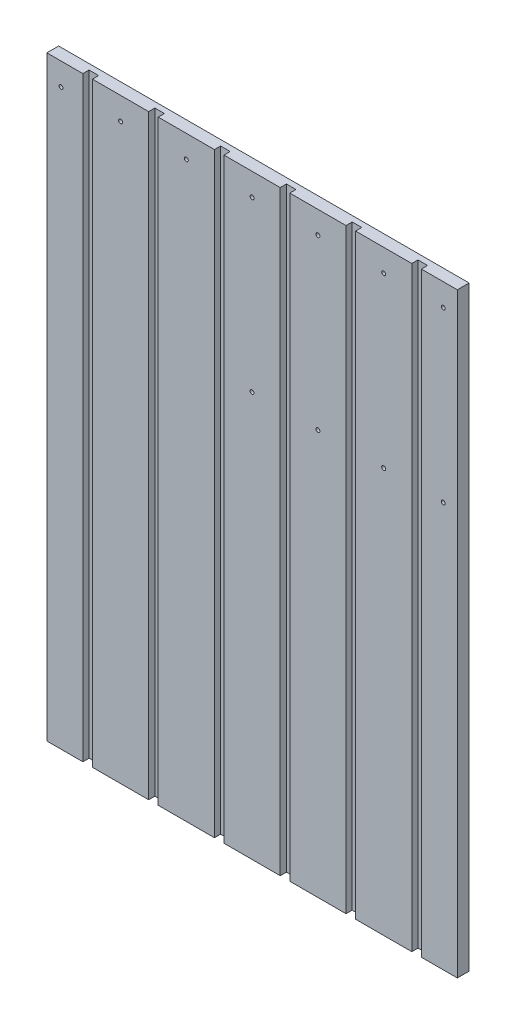
ISO-10303-21;
HEADER;
FILE_DESCRIPTION(('STEP AP214'),'2;1');
FILE_NAME('part.step','',(''),(''),'','','');
FILE_SCHEMA(('AUTOMOTIVE_DESIGN { 1 0 10303 214 1 1 1 1 }'));
ENDSEC;
DATA;
#1=APPLICATION_CONTEXT('core data for automotive mechanical design processes');
#2=APPLICATION_PROTOCOL_DEFINITION('international standard','automotive_design',2000,#1);
#3=PRODUCT_CONTEXT('',#1,'mechanical');
#4=PRODUCT('Part','Part','',(#3));
#5=PRODUCT_RELATED_PRODUCT_CATEGORY('part','',(#4));
#6=PRODUCT_DEFINITION_FORMATION('','',#4);
#7=PRODUCT_DEFINITION_CONTEXT('part definition',#1,'design');
#8=PRODUCT_DEFINITION('design','',#6,#7);
#9=PRODUCT_DEFINITION_SHAPE('','',#8);
#10=(LENGTH_UNIT() NAMED_UNIT(*) SI_UNIT(.MILLI.,.METRE.));
#11=(NAMED_UNIT(*) PLANE_ANGLE_UNIT() SI_UNIT($,.RADIAN.));
#12=(NAMED_UNIT(*) SI_UNIT($,.STERADIAN.) SOLID_ANGLE_UNIT());
#13=UNCERTAINTY_MEASURE_WITH_UNIT(LENGTH_MEASURE(1.E-05),#10,'distance_accuracy_value','');
#14=(GEOMETRIC_REPRESENTATION_CONTEXT(3) GLOBAL_UNCERTAINTY_ASSIGNED_CONTEXT((#13)) GLOBAL_UNIT_ASSIGNED_CONTEXT((#10,
#11,#12)) REPRESENTATION_CONTEXT('',''));
#15=CARTESIAN_POINT('',(0.,0.,0.));
#16=DIRECTION('',(0.,0.,1.));
#17=DIRECTION('',(1.,0.,0.));
#18=AXIS2_PLACEMENT_3D('',#15,#16,#17);
#19=CARTESIAN_POINT('',(0.,0.,21.));
#20=DIRECTION('',(0.,0.,-1.));
#21=DIRECTION('',(-1.,0.,0.));
#22=AXIS2_PLACEMENT_3D('',#19,#20,#21);
#23=PLANE('',#22);
#24=CARTESIAN_POINT('',(117.,190.,21.));
#25=DIRECTION('',(0.,0.,1.));
#26=DIRECTION('',(1.,0.,0.));
#27=AXIS2_PLACEMENT_3D('',#24,#25,#26);
#28=CIRCLE('',#27,3.50000000000001);
#29=CARTESIAN_POINT('',(120.5,190.,21.));
#30=VERTEX_POINT('',#29);
#31=EDGE_CURVE('E598',#30,#30,#28,.T.);
#32=ORIENTED_EDGE('',*,*,#31,.F.);
#33=EDGE_LOOP('',(#32));
#34=FACE_BOUND('',#33,.T.);
#35=CARTESIAN_POINT('',(117.,490.,21.));
#36=DIRECTION('',(0.,0.,1.));
#37=DIRECTION('',(1.,0.,0.));
#38=AXIS2_PLACEMENT_3D('',#35,#36,#37);
#39=CIRCLE('',#38,3.50000000000001);
#40=CARTESIAN_POINT('',(120.5,490.,21.));
#41=VERTEX_POINT('',#40);
#42=EDGE_CURVE('E605',#41,#41,#39,.T.);
#43=ORIENTED_EDGE('',*,*,#42,.F.);
#44=EDGE_LOOP('',(#43));
#45=FACE_BOUND('',#44,.T.);
#46=DIRECTION('',(1.,0.,0.));
#47=VECTOR('',#46,1.);
#48=CARTESIAN_POINT('',(365.,-530.,21.));
#49=LINE('',#48,#47);
#50=CARTESIAN_POINT('',(67.0000000000002,-530.,21.));
#51=VERTEX_POINT('',#50);
#52=CARTESIAN_POINT('',(167.,-530.,21.));
#53=VERTEX_POINT('',#52);
#54=EDGE_CURVE('E541',#51,#53,#49,.T.);
#55=ORIENTED_EDGE('',*,*,#54,.T.);
#56=DIRECTION('',(0.,-1.,0.));
#57=VECTOR('',#56,1.);
#58=CARTESIAN_POINT('',(167.,530.,21.));
#59=LINE('',#58,#57);
#60=CARTESIAN_POINT('',(167.,530.,21.));
#61=VERTEX_POINT('',#60);
#62=EDGE_CURVE('E275',#61,#53,#59,.T.);
#63=ORIENTED_EDGE('',*,*,#62,.F.);
#64=DIRECTION('',(-1.,0.,0.));
#65=VECTOR('',#64,1.);
#66=CARTESIAN_POINT('',(365.,530.,21.));
#67=LINE('',#66,#65);
#68=CARTESIAN_POINT('',(67.,530.,21.));
#69=VERTEX_POINT('',#68);
#70=EDGE_CURVE('E515',#61,#69,#67,.T.);
#71=ORIENTED_EDGE('',*,*,#70,.T.);
#72=DIRECTION('',(0.,1.,0.));
#73=VECTOR('',#72,1.);
#74=CARTESIAN_POINT('',(67.,530.,21.));
#75=LINE('',#74,#73);
#76=EDGE_CURVE('E367',#51,#69,#75,.T.);
#77=ORIENTED_EDGE('',*,*,#76,.F.);
#78=EDGE_LOOP('',(#55,#63,#71,#77));
#79=FACE_BOUND('',#78,.T.);
#80=ADVANCED_FACE('F33',(#34,#45,#79),#23,.F.);
#81=CARTESIAN_POINT('',(234.,190.,21.));
#82=DIRECTION('',(0.,0.,1.));
#83=DIRECTION('',(1.,0.,0.));
#84=AXIS2_PLACEMENT_3D('',#81,#82,#83);
#85=CIRCLE('',#84,3.49999999999999);
#86=CARTESIAN_POINT('',(237.5,190.,21.));
#87=VERTEX_POINT('',#86);
#88=EDGE_CURVE('E616',#87,#87,#85,.T.);
#89=ORIENTED_EDGE('',*,*,#88,.F.);
#90=EDGE_LOOP('',(#89));
#91=FACE_BOUND('',#90,.T.);
#92=CARTESIAN_POINT('',(234.,490.,21.));
#93=DIRECTION('',(0.,0.,1.));
#94=DIRECTION('',(1.,0.,0.));
#95=AXIS2_PLACEMENT_3D('',#92,#93,#94);
#96=CIRCLE('',#95,3.49999999999999);
#97=CARTESIAN_POINT('',(237.5,490.,21.));
#98=VERTEX_POINT('',#97);
#99=EDGE_CURVE('E608',#98,#98,#96,.T.);
#100=ORIENTED_EDGE('',*,*,#99,.F.);
#101=EDGE_LOOP('',(#100));
#102=FACE_BOUND('',#101,.T.);
#103=CARTESIAN_POINT('',(284.,530.,21.));
#104=VERTEX_POINT('',#103);
#105=CARTESIAN_POINT('',(184.,530.,21.));
#106=VERTEX_POINT('',#105);
#107=EDGE_CURVE('E405',#104,#106,#67,.T.);
#108=ORIENTED_EDGE('',*,*,#107,.T.);
#109=DIRECTION('',(0.,1.,0.));
#110=VECTOR('',#109,1.);
#111=CARTESIAN_POINT('',(184.,530.,21.));
#112=LINE('',#111,#110);
#113=CARTESIAN_POINT('',(184.,-530.,21.));
#114=VERTEX_POINT('',#113);
#115=EDGE_CURVE('E265',#114,#106,#112,.T.);
#116=ORIENTED_EDGE('',*,*,#115,.F.);
#117=CARTESIAN_POINT('',(284.,-530.,21.));
#118=VERTEX_POINT('',#117);
#119=EDGE_CURVE('E539',#114,#118,#49,.T.);
#120=ORIENTED_EDGE('',*,*,#119,.T.);
#121=DIRECTION('',(0.,-1.,0.));
#122=VECTOR('',#121,1.);
#123=CARTESIAN_POINT('',(284.,530.,21.));
#124=LINE('',#123,#122);
#125=EDGE_CURVE('E303',#104,#118,#124,.T.);
#126=ORIENTED_EDGE('',*,*,#125,.F.);
#127=EDGE_LOOP('',(#108,#116,#120,#126));
#128=FACE_BOUND('',#127,.T.);
#129=ADVANCED_FACE('F527',(#91,#102,#128),#23,.F.);
#130=CARTESIAN_POINT('',(-234.,490.,21.));
#131=DIRECTION('',(0.,0.,1.));
#132=DIRECTION('',(-1.,0.,0.));
#133=AXIS2_PLACEMENT_3D('',#130,#131,#132);
#134=CIRCLE('',#133,3.49999999999999);
#135=CARTESIAN_POINT('',(-237.5,490.,21.));
#136=VERTEX_POINT('',#135);
#137=EDGE_CURVE('E595',#136,#136,#134,.T.);
#138=ORIENTED_EDGE('',*,*,#137,.F.);
#139=EDGE_LOOP('',(#138));
#140=FACE_BOUND('',#139,.T.);
#141=CARTESIAN_POINT('',(-184.,530.,21.));
#142=VERTEX_POINT('',#141);
#143=CARTESIAN_POINT('',(-284.,530.,21.));
#144=VERTEX_POINT('',#143);
#145=EDGE_CURVE('E504',#142,#144,#67,.T.);
#146=ORIENTED_EDGE('',*,*,#145,.T.);
#147=DIRECTION('',(0.,1.,0.));
#148=VECTOR('',#147,1.);
#149=CARTESIAN_POINT('',(-284.,530.,21.));
#150=LINE('',#149,#148);
#151=CARTESIAN_POINT('',(-284.,-530.,21.));
#152=VERTEX_POINT('',#151);
#153=EDGE_CURVE('E329',#152,#144,#150,.T.);
#154=ORIENTED_EDGE('',*,*,#153,.F.);
#155=CARTESIAN_POINT('',(-184.,-530.,21.));
#156=VERTEX_POINT('',#155);
#157=EDGE_CURVE('E398',#152,#156,#49,.T.);
#158=ORIENTED_EDGE('',*,*,#157,.T.);
#159=DIRECTION('',(0.,-1.,0.));
#160=VECTOR('',#159,1.);
#161=CARTESIAN_POINT('',(-184.,530.,21.));
#162=LINE('',#161,#160);
#163=EDGE_CURVE('E344',#142,#156,#162,.T.);
#164=ORIENTED_EDGE('',*,*,#163,.F.);
#165=EDGE_LOOP('',(#146,#154,#158,#164));
#166=FACE_BOUND('',#165,.T.);
#167=ADVANCED_FACE('F569',(#140,#166),#23,.F.);
#168=CARTESIAN_POINT('',(-117.,490.,21.));
#169=DIRECTION('',(0.,0.,1.));
#170=DIRECTION('',(-1.,0.,0.));
#171=AXIS2_PLACEMENT_3D('',#168,#169,#170);
#172=CIRCLE('',#171,3.50000000000001);
#173=CARTESIAN_POINT('',(-120.5,490.,21.));
#174=VERTEX_POINT('',#173);
#175=EDGE_CURVE('E601',#174,#174,#172,.T.);
#176=ORIENTED_EDGE('',*,*,#175,.F.);
#177=EDGE_LOOP('',(#176));
#178=FACE_BOUND('',#177,.T.);
#179=CARTESIAN_POINT('',(-66.9999999999999,530.,21.));
#180=VERTEX_POINT('',#179);
#181=CARTESIAN_POINT('',(-167.,530.,21.));
#182=VERTEX_POINT('',#181);
#183=EDGE_CURVE('E506',#180,#182,#67,.T.);
#184=ORIENTED_EDGE('',*,*,#183,.T.);
#185=DIRECTION('',(0.,1.,0.));
#186=VECTOR('',#185,1.);
#187=CARTESIAN_POINT('',(-167.,530.,21.));
#188=LINE('',#187,#186);
#189=CARTESIAN_POINT('',(-167.,-530.,21.));
#190=VERTEX_POINT('',#189);
#191=EDGE_CURVE('E256',#190,#182,#188,.T.);
#192=ORIENTED_EDGE('',*,*,#191,.F.);
#193=CARTESIAN_POINT('',(-67.0000000000001,-530.,21.));
#194=VERTEX_POINT('',#193);
#195=EDGE_CURVE('E848',#190,#194,#49,.T.);
#196=ORIENTED_EDGE('',*,*,#195,.T.);
#197=DIRECTION('',(0.,-1.,0.));
#198=VECTOR('',#197,1.);
#199=CARTESIAN_POINT('',(-67.,530.,21.));
#200=LINE('',#199,#198);
#201=EDGE_CURVE('E241',#180,#194,#200,.T.);
#202=ORIENTED_EDGE('',*,*,#201,.F.);
#203=EDGE_LOOP('',(#184,#192,#196,#202));
#204=FACE_BOUND('',#203,.T.);
#205=ADVANCED_FACE('F589',(#178,#204),#23,.F.);
#206=CARTESIAN_POINT('',(0.,190.,21.));
#207=DIRECTION('',(0.,0.,1.));
#208=DIRECTION('',(1.,0.,0.));
#209=AXIS2_PLACEMENT_3D('',#206,#207,#208);
#210=CIRCLE('',#209,3.5);
#211=CARTESIAN_POINT('',(3.5,190.,21.));
#212=VERTEX_POINT('',#211);
#213=EDGE_CURVE('E594',#212,#212,#210,.T.);
#214=ORIENTED_EDGE('',*,*,#213,.F.);
#215=EDGE_LOOP('',(#214));
#216=FACE_BOUND('',#215,.T.);
#217=CARTESIAN_POINT('',(0.,490.,21.));
#218=DIRECTION('',(0.,0.,1.));
#219=DIRECTION('',(1.,0.,0.));
#220=AXIS2_PLACEMENT_3D('',#217,#218,#219);
#221=CIRCLE('',#220,3.5);
#222=CARTESIAN_POINT('',(3.5,490.,21.));
#223=VERTEX_POINT('',#222);
#224=EDGE_CURVE('E424',#223,#223,#221,.T.);
#225=ORIENTED_EDGE('',*,*,#224,.F.);
#226=EDGE_LOOP('',(#225));
#227=FACE_BOUND('',#226,.T.);
#228=CARTESIAN_POINT('',(50.,530.,21.));
#229=VERTEX_POINT('',#228);
#230=CARTESIAN_POINT('',(-50.,530.,21.));
#231=VERTEX_POINT('',#230);
#232=EDGE_CURVE('E511',#229,#231,#67,.T.);
#233=ORIENTED_EDGE('',*,*,#232,.T.);
#234=DIRECTION('',(0.,1.,0.));
#235=VECTOR('',#234,1.);
#236=CARTESIAN_POINT('',(-50.,530.,21.));
#237=LINE('',#236,#235);
#238=CARTESIAN_POINT('',(-50.0000000000001,-530.,21.));
#239=VERTEX_POINT('',#238);
#240=EDGE_CURVE('E225',#239,#231,#237,.T.);
#241=ORIENTED_EDGE('',*,*,#240,.F.);
#242=CARTESIAN_POINT('',(50.0000000000001,-530.,21.));
#243=VERTEX_POINT('',#242);
#244=EDGE_CURVE('E543',#239,#243,#49,.T.);
#245=ORIENTED_EDGE('',*,*,#244,.T.);
#246=DIRECTION('',(0.,-1.,0.));
#247=VECTOR('',#246,1.);
#248=CARTESIAN_POINT('',(50.,530.,21.));
#249=LINE('',#248,#247);
#250=EDGE_CURVE('E281',#229,#243,#249,.T.);
#251=ORIENTED_EDGE('',*,*,#250,.F.);
#252=EDGE_LOOP('',(#233,#241,#245,#251));
#253=FACE_BOUND('',#252,.T.);
#254=ADVANCED_FACE('F583',(#216,#227,#253),#23,.F.);
#255=CARTESIAN_POINT('',(-340.,490.,21.));
#256=DIRECTION('',(0.,0.,1.));
#257=DIRECTION('',(-1.,0.,0.));
#258=AXIS2_PLACEMENT_3D('',#255,#256,#257);
#259=CIRCLE('',#258,3.50000000000002);
#260=CARTESIAN_POINT('',(-343.5,490.,21.));
#261=VERTEX_POINT('',#260);
#262=EDGE_CURVE('E593',#261,#261,#259,.T.);
#263=ORIENTED_EDGE('',*,*,#262,.F.);
#264=EDGE_LOOP('',(#263));
#265=FACE_BOUND('',#264,.T.);
#266=CARTESIAN_POINT('',(-365.,-530.,21.));
#267=VERTEX_POINT('',#266);
#268=CARTESIAN_POINT('',(-301.,-530.,21.));
#269=VERTEX_POINT('',#268);
#270=EDGE_CURVE('E394',#267,#269,#49,.T.);
#271=ORIENTED_EDGE('',*,*,#270,.T.);
#272=DIRECTION('',(0.,-1.,0.));
#273=VECTOR('',#272,1.);
#274=CARTESIAN_POINT('',(-301.,530.,21.));
#275=LINE('',#274,#273);
#276=CARTESIAN_POINT('',(-301.,530.,21.));
#277=VERTEX_POINT('',#276);
#278=EDGE_CURVE('E319',#277,#269,#275,.T.);
#279=ORIENTED_EDGE('',*,*,#278,.F.);
#280=CARTESIAN_POINT('',(-365.,530.,21.));
#281=VERTEX_POINT('',#280);
#282=EDGE_CURVE('E400',#277,#281,#67,.T.);
#283=ORIENTED_EDGE('',*,*,#282,.T.);
#284=DIRECTION('',(0.,-1.,0.));
#285=VECTOR('',#284,1.);
#286=CARTESIAN_POINT('',(-365.,530.,21.));
#287=LINE('',#286,#285);
#288=EDGE_CURVE('E389',#281,#267,#287,.T.);
#289=ORIENTED_EDGE('',*,*,#288,.T.);
#290=EDGE_LOOP('',(#271,#279,#283,#289));
#291=FACE_BOUND('',#290,.T.);
#292=ADVANCED_FACE('F503',(#265,#291),#23,.F.);
#293=CARTESIAN_POINT('',(-365.,530.,21.));
#294=DIRECTION('',(1.,0.,0.));
#295=DIRECTION('',(0.,1.,0.));
#296=AXIS2_PLACEMENT_3D('',#293,#294,#295);
#297=PLANE('',#296);
#298=DIRECTION('',(0.,-1.,0.));
#299=VECTOR('',#298,1.);
#300=CARTESIAN_POINT('',(-365.,530.,0.));
#301=LINE('',#300,#299);
#302=CARTESIAN_POINT('',(-365.,530.,0.));
#303=VERTEX_POINT('',#302);
#304=CARTESIAN_POINT('',(-365.,-530.,0.));
#305=VERTEX_POINT('',#304);
#306=EDGE_CURVE('E381',#303,#305,#301,.T.);
#307=ORIENTED_EDGE('',*,*,#306,.T.);
#308=DIRECTION('',(0.,0.,-1.));
#309=VECTOR('',#308,1.);
#310=CARTESIAN_POINT('',(-365.,-530.,21.));
#311=LINE('',#310,#309);
#312=EDGE_CURVE('E11',#267,#305,#311,.T.);
#313=ORIENTED_EDGE('',*,*,#312,.F.);
#314=ORIENTED_EDGE('',*,*,#288,.F.);
#315=DIRECTION('',(0.,0.,-1.));
#316=VECTOR('',#315,1.);
#317=CARTESIAN_POINT('',(-365.,530.,21.));
#318=LINE('',#317,#316);
#319=EDGE_CURVE('E404',#281,#303,#318,.T.);
#320=ORIENTED_EDGE('',*,*,#319,.T.);
#321=EDGE_LOOP('',(#307,#313,#314,#320));
#322=FACE_BOUND('',#321,.T.);
#323=ADVANCED_FACE('F35',(#322),#297,.F.);
#324=CARTESIAN_POINT('',(365.,-530.,21.));
#325=DIRECTION('',(0.,1.,0.));
#326=DIRECTION('',(0.,0.,1.));
#327=AXIS2_PLACEMENT_3D('',#324,#325,#326);
#328=PLANE('',#327);
#329=DIRECTION('',(1.,0.,0.));
#330=VECTOR('',#329,1.);
#331=CARTESIAN_POINT('',(167.,-530.,10.));
#332=LINE('',#331,#330);
#333=CARTESIAN_POINT('',(167.,-530.,10.));
#334=VERTEX_POINT('',#333);
#335=CARTESIAN_POINT('',(184.,-530.,10.));
#336=VERTEX_POINT('',#335);
#337=EDGE_CURVE('E264',#334,#336,#332,.T.);
#338=ORIENTED_EDGE('',*,*,#337,.F.);
#339=DIRECTION('',(0.,0.,1.));
#340=VECTOR('',#339,1.);
#341=CARTESIAN_POINT('',(167.,-530.,10.));
#342=LINE('',#341,#340);
#343=EDGE_CURVE('E274',#334,#53,#342,.T.);
#344=ORIENTED_EDGE('',*,*,#343,.T.);
#345=ORIENTED_EDGE('',*,*,#54,.F.);
#346=DIRECTION('',(0.,0.,1.));
#347=VECTOR('',#346,1.);
#348=CARTESIAN_POINT('',(67.0000000000001,-530.,10.));
#349=LINE('',#348,#347);
#350=CARTESIAN_POINT('',(67.0000000000001,-530.,10.));
#351=VERTEX_POINT('',#350);
#352=EDGE_CURVE('E385',#351,#51,#349,.T.);
#353=ORIENTED_EDGE('',*,*,#352,.F.);
#354=DIRECTION('',(1.,0.,0.));
#355=VECTOR('',#354,1.);
#356=CARTESIAN_POINT('',(50.0000000000001,-530.,10.));
#357=LINE('',#356,#355);
#358=CARTESIAN_POINT('',(50.0000000000001,-530.,10.));
#359=VERTEX_POINT('',#358);
#360=EDGE_CURVE('E366',#359,#351,#357,.T.);
#361=ORIENTED_EDGE('',*,*,#360,.F.);
#362=DIRECTION('',(0.,0.,1.));
#363=VECTOR('',#362,1.);
#364=CARTESIAN_POINT('',(50.0000000000001,-530.,10.));
#365=LINE('',#364,#363);
#366=EDGE_CURVE('E376',#359,#243,#365,.T.);
#367=ORIENTED_EDGE('',*,*,#366,.T.);
#368=ORIENTED_EDGE('',*,*,#244,.F.);
#369=DIRECTION('',(0.,0.,1.));
#370=VECTOR('',#369,1.);
#371=CARTESIAN_POINT('',(-50.0000000000001,-530.,10.));
#372=LINE('',#371,#370);
#373=CARTESIAN_POINT('',(-50.0000000000001,-530.,10.));
#374=VERTEX_POINT('',#373);
#375=EDGE_CURVE('E254',#374,#239,#372,.T.);
#376=ORIENTED_EDGE('',*,*,#375,.F.);
#377=DIRECTION('',(1.,0.,0.));
#378=VECTOR('',#377,1.);
#379=CARTESIAN_POINT('',(-50.0000000000001,-530.,10.));
#380=LINE('',#379,#378);
#381=CARTESIAN_POINT('',(-67.0000000000001,-530.,10.));
#382=VERTEX_POINT('',#381);
#383=EDGE_CURVE('E231',#382,#374,#380,.T.);
#384=ORIENTED_EDGE('',*,*,#383,.F.);
#385=DIRECTION('',(0.,0.,1.));
#386=VECTOR('',#385,1.);
#387=CARTESIAN_POINT('',(-67.0000000000001,-530.,10.));
#388=LINE('',#387,#386);
#389=EDGE_CURVE('E257',#382,#194,#388,.T.);
#390=ORIENTED_EDGE('',*,*,#389,.T.);
#391=ORIENTED_EDGE('',*,*,#195,.F.);
#392=DIRECTION('',(0.,0.,1.));
#393=VECTOR('',#392,1.);
#394=CARTESIAN_POINT('',(-167.,-530.,10.));
#395=LINE('',#394,#393);
#396=CARTESIAN_POINT('',(-167.,-530.,10.));
#397=VERTEX_POINT('',#396);
#398=EDGE_CURVE('E331',#397,#190,#395,.T.);
#399=ORIENTED_EDGE('',*,*,#398,.F.);
#400=DIRECTION('',(1.,0.,0.));
#401=VECTOR('',#400,1.);
#402=CARTESIAN_POINT('',(-167.,-530.,10.));
#403=LINE('',#402,#401);
#404=CARTESIAN_POINT('',(-184.,-530.,10.));
#405=VERTEX_POINT('',#404);
#406=EDGE_CURVE('E350',#405,#397,#403,.T.);
#407=ORIENTED_EDGE('',*,*,#406,.F.);
#408=DIRECTION('',(0.,0.,1.));
#409=VECTOR('',#408,1.);
#410=CARTESIAN_POINT('',(-184.,-530.,10.));
#411=LINE('',#410,#409);
#412=EDGE_CURVE('E357',#405,#156,#411,.T.);
#413=ORIENTED_EDGE('',*,*,#412,.T.);
#414=ORIENTED_EDGE('',*,*,#157,.F.);
#415=DIRECTION('',(0.,0.,1.));
#416=VECTOR('',#415,1.);
#417=CARTESIAN_POINT('',(-284.,-530.,10.));
#418=LINE('',#417,#416);
#419=CARTESIAN_POINT('',(-284.,-530.,10.));
#420=VERTEX_POINT('',#419);
#421=EDGE_CURVE('E305',#420,#152,#418,.T.);
#422=ORIENTED_EDGE('',*,*,#421,.F.);
#423=DIRECTION('',(1.,0.,0.));
#424=VECTOR('',#423,1.);
#425=CARTESIAN_POINT('',(-284.,-530.,10.));
#426=LINE('',#425,#424);
#427=CARTESIAN_POINT('',(-301.,-530.,10.));
#428=VERTEX_POINT('',#427);
#429=EDGE_CURVE('E325',#428,#420,#426,.T.);
#430=ORIENTED_EDGE('',*,*,#429,.F.);
#431=DIRECTION('',(0.,0.,1.));
#432=VECTOR('',#431,1.);
#433=CARTESIAN_POINT('',(-301.,-530.,10.));
#434=LINE('',#433,#432);
#435=EDGE_CURVE('E334',#428,#269,#434,.T.);
#436=ORIENTED_EDGE('',*,*,#435,.T.);
#437=ORIENTED_EDGE('',*,*,#270,.F.);
#438=ORIENTED_EDGE('',*,*,#312,.T.);
#439=DIRECTION('',(1.,0.,0.));
#440=VECTOR('',#439,1.);
#441=CARTESIAN_POINT('',(365.,-530.,0.));
#442=LINE('',#441,#440);
#443=CARTESIAN_POINT('',(365.,-530.,0.));
#444=VERTEX_POINT('',#443);
#445=EDGE_CURVE('E408',#305,#444,#442,.T.);
#446=ORIENTED_EDGE('',*,*,#445,.T.);
#447=DIRECTION('',(0.,0.,-1.));
#448=VECTOR('',#447,1.);
#449=CARTESIAN_POINT('',(365.,-530.,21.));
#450=LINE('',#449,#448);
#451=CARTESIAN_POINT('',(365.,-530.,21.));
#452=VERTEX_POINT('',#451);
#453=EDGE_CURVE('E42',#452,#444,#450,.T.);
#454=ORIENTED_EDGE('',*,*,#453,.F.);
#455=CARTESIAN_POINT('',(301.,-530.,21.));
#456=VERTEX_POINT('',#455);
#457=EDGE_CURVE('E392',#456,#452,#49,.T.);
#458=ORIENTED_EDGE('',*,*,#457,.F.);
#459=DIRECTION('',(0.,0.,1.));
#460=VECTOR('',#459,1.);
#461=CARTESIAN_POINT('',(301.,-530.,10.));
#462=LINE('',#461,#460);
#463=CARTESIAN_POINT('',(301.,-530.,10.));
#464=VERTEX_POINT('',#463);
#465=EDGE_CURVE('E311',#464,#456,#462,.T.);
#466=ORIENTED_EDGE('',*,*,#465,.F.);
#467=DIRECTION('',(1.,0.,0.));
#468=VECTOR('',#467,1.);
#469=CARTESIAN_POINT('',(284.,-530.,10.));
#470=LINE('',#469,#468);
#471=CARTESIAN_POINT('',(284.,-530.,10.));
#472=VERTEX_POINT('',#471);
#473=EDGE_CURVE('E292',#472,#464,#470,.T.);
#474=ORIENTED_EDGE('',*,*,#473,.F.);
#475=DIRECTION('',(0.,0.,1.));
#476=VECTOR('',#475,1.);
#477=CARTESIAN_POINT('',(284.,-530.,10.));
#478=LINE('',#477,#476);
#479=EDGE_CURVE('E302',#472,#118,#478,.T.);
#480=ORIENTED_EDGE('',*,*,#479,.T.);
#481=ORIENTED_EDGE('',*,*,#119,.F.);
#482=DIRECTION('',(0.,0.,1.));
#483=VECTOR('',#482,1.);
#484=CARTESIAN_POINT('',(184.,-530.,10.));
#485=LINE('',#484,#483);
#486=EDGE_CURVE('E285',#336,#114,#485,.T.);
#487=ORIENTED_EDGE('',*,*,#486,.F.);
#488=EDGE_LOOP('',(#338,#344,#345,#353,#361,#367,#368,#376,#384,#390,#391,#399,#407,#413,#414,
#422,#430,#436,#437,#438,#446,#454,#458,#466,#474,#480,#481,#487));
#489=FACE_BOUND('',#488,.T.);
#490=ADVANCED_FACE('F499',(#489),#328,.F.);
#491=CARTESIAN_POINT('',(365.,530.,21.));
#492=DIRECTION('',(-1.,0.,0.));
#493=DIRECTION('',(0.,-1.,0.));
#494=AXIS2_PLACEMENT_3D('',#491,#492,#493);
#495=PLANE('',#494);
#496=DIRECTION('',(0.,1.,0.));
#497=VECTOR('',#496,1.);
#498=CARTESIAN_POINT('',(365.,530.,0.));
#499=LINE('',#498,#497);
#500=CARTESIAN_POINT('',(365.,530.,0.));
#501=VERTEX_POINT('',#500);
#502=EDGE_CURVE('E410',#444,#501,#499,.T.);
#503=ORIENTED_EDGE('',*,*,#502,.T.);
#504=DIRECTION('',(0.,0.,-1.));
#505=VECTOR('',#504,1.);
#506=CARTESIAN_POINT('',(365.,530.,21.));
#507=LINE('',#506,#505);
#508=CARTESIAN_POINT('',(365.,530.,21.));
#509=VERTEX_POINT('',#508);
#510=EDGE_CURVE('E415',#509,#501,#507,.T.);
#511=ORIENTED_EDGE('',*,*,#510,.F.);
#512=DIRECTION('',(0.,1.,0.));
#513=VECTOR('',#512,1.);
#514=CARTESIAN_POINT('',(365.,530.,21.));
#515=LINE('',#514,#513);
#516=EDGE_CURVE('E397',#452,#509,#515,.T.);
#517=ORIENTED_EDGE('',*,*,#516,.F.);
#518=ORIENTED_EDGE('',*,*,#453,.T.);
#519=EDGE_LOOP('',(#503,#511,#517,#518));
#520=FACE_BOUND('',#519,.T.);
#521=ADVANCED_FACE('F494',(#520),#495,.F.);
#522=CARTESIAN_POINT('',(365.,530.,21.));
#523=DIRECTION('',(0.,-1.,0.));
#524=DIRECTION('',(1.,0.,0.));
#525=AXIS2_PLACEMENT_3D('',#522,#523,#524);
#526=PLANE('',#525);
#527=ORIENTED_EDGE('',*,*,#70,.F.);
#528=DIRECTION('',(0.,0.,1.));
#529=VECTOR('',#528,1.);
#530=CARTESIAN_POINT('',(167.,530.,10.));
#531=LINE('',#530,#529);
#532=CARTESIAN_POINT('',(167.,530.,10.));
#533=VERTEX_POINT('',#532);
#534=EDGE_CURVE('E279',#533,#61,#531,.T.);
#535=ORIENTED_EDGE('',*,*,#534,.F.);
#536=DIRECTION('',(-1.,0.,0.));
#537=VECTOR('',#536,1.);
#538=CARTESIAN_POINT('',(167.,530.,10.));
#539=LINE('',#538,#537);
#540=CARTESIAN_POINT('',(184.,530.,10.));
#541=VERTEX_POINT('',#540);
#542=EDGE_CURVE('E271',#541,#533,#539,.T.);
#543=ORIENTED_EDGE('',*,*,#542,.F.);
#544=DIRECTION('',(0.,0.,1.));
#545=VECTOR('',#544,1.);
#546=CARTESIAN_POINT('',(184.,530.,10.));
#547=LINE('',#546,#545);
#548=EDGE_CURVE('E282',#541,#106,#547,.T.);
#549=ORIENTED_EDGE('',*,*,#548,.T.);
#550=ORIENTED_EDGE('',*,*,#107,.F.);
#551=DIRECTION('',(0.,0.,1.));
#552=VECTOR('',#551,1.);
#553=CARTESIAN_POINT('',(284.,530.,10.));
#554=LINE('',#553,#552);
#555=CARTESIAN_POINT('',(284.,530.,10.));
#556=VERTEX_POINT('',#555);
#557=EDGE_CURVE('E277',#556,#104,#554,.T.);
#558=ORIENTED_EDGE('',*,*,#557,.F.);
#559=DIRECTION('',(-1.,0.,0.));
#560=VECTOR('',#559,1.);
#561=CARTESIAN_POINT('',(284.,530.,10.));
#562=LINE('',#561,#560);
#563=CARTESIAN_POINT('',(301.,530.,10.));
#564=VERTEX_POINT('',#563);
#565=EDGE_CURVE('E299',#564,#556,#562,.T.);
#566=ORIENTED_EDGE('',*,*,#565,.F.);
#567=DIRECTION('',(0.,0.,1.));
#568=VECTOR('',#567,1.);
#569=CARTESIAN_POINT('',(301.,530.,10.));
#570=LINE('',#569,#568);
#571=CARTESIAN_POINT('',(301.,530.,21.));
#572=VERTEX_POINT('',#571);
#573=EDGE_CURVE('E308',#564,#572,#570,.T.);
#574=ORIENTED_EDGE('',*,*,#573,.T.);
#575=EDGE_CURVE('E401',#509,#572,#67,.T.);
#576=ORIENTED_EDGE('',*,*,#575,.F.);
#577=ORIENTED_EDGE('',*,*,#510,.T.);
#578=DIRECTION('',(-1.,0.,0.));
#579=VECTOR('',#578,1.);
#580=CARTESIAN_POINT('',(365.,530.,0.));
#581=LINE('',#580,#579);
#582=EDGE_CURVE('E393',#501,#303,#581,.T.);
#583=ORIENTED_EDGE('',*,*,#582,.T.);
#584=ORIENTED_EDGE('',*,*,#319,.F.);
#585=ORIENTED_EDGE('',*,*,#282,.F.);
#586=DIRECTION('',(0.,0.,1.));
#587=VECTOR('',#586,1.);
#588=CARTESIAN_POINT('',(-301.,530.,10.));
#589=LINE('',#588,#587);
#590=CARTESIAN_POINT('',(-301.,530.,10.));
#591=VERTEX_POINT('',#590);
#592=EDGE_CURVE('E50',#591,#277,#589,.T.);
#593=ORIENTED_EDGE('',*,*,#592,.F.);
#594=DIRECTION('',(-1.,0.,0.));
#595=VECTOR('',#594,1.);
#596=CARTESIAN_POINT('',(-284.,530.,10.));
#597=LINE('',#596,#595);
#598=CARTESIAN_POINT('',(-284.,530.,10.));
#599=VERTEX_POINT('',#598);
#600=EDGE_CURVE('E318',#599,#591,#597,.T.);
#601=ORIENTED_EDGE('',*,*,#600,.F.);
#602=DIRECTION('',(0.,0.,1.));
#603=VECTOR('',#602,1.);
#604=CARTESIAN_POINT('',(-284.,530.,10.));
#605=LINE('',#604,#603);
#606=EDGE_CURVE('E328',#599,#144,#605,.T.);
#607=ORIENTED_EDGE('',*,*,#606,.T.);
#608=ORIENTED_EDGE('',*,*,#145,.F.);
#609=DIRECTION('',(0.,0.,1.));
#610=VECTOR('',#609,1.);
#611=CARTESIAN_POINT('',(-184.,530.,10.));
#612=LINE('',#611,#610);
#613=CARTESIAN_POINT('',(-184.,530.,10.));
#614=VERTEX_POINT('',#613);
#615=EDGE_CURVE('E58',#614,#142,#612,.T.);
#616=ORIENTED_EDGE('',*,*,#615,.F.);
#617=DIRECTION('',(-1.,0.,0.));
#618=VECTOR('',#617,1.);
#619=CARTESIAN_POINT('',(-167.,530.,10.));
#620=LINE('',#619,#618);
#621=CARTESIAN_POINT('',(-167.,530.,10.));
#622=VERTEX_POINT('',#621);
#623=EDGE_CURVE('E343',#622,#614,#620,.T.);
#624=ORIENTED_EDGE('',*,*,#623,.F.);
#625=DIRECTION('',(0.,0.,1.));
#626=VECTOR('',#625,1.);
#627=CARTESIAN_POINT('',(-167.,530.,10.));
#628=LINE('',#627,#626);
#629=EDGE_CURVE('E353',#622,#182,#628,.T.);
#630=ORIENTED_EDGE('',*,*,#629,.T.);
#631=ORIENTED_EDGE('',*,*,#183,.F.);
#632=DIRECTION('',(0.,0.,1.));
#633=VECTOR('',#632,1.);
#634=CARTESIAN_POINT('',(-67.,530.,10.));
#635=LINE('',#634,#633);
#636=CARTESIAN_POINT('',(-67.,530.,10.));
#637=VERTEX_POINT('',#636);
#638=EDGE_CURVE('E230',#637,#180,#635,.T.);
#639=ORIENTED_EDGE('',*,*,#638,.F.);
#640=DIRECTION('',(-1.,0.,0.));
#641=VECTOR('',#640,1.);
#642=CARTESIAN_POINT('',(-50.,530.,10.));
#643=LINE('',#642,#641);
#644=CARTESIAN_POINT('',(-50.,530.,10.));
#645=VERTEX_POINT('',#644);
#646=EDGE_CURVE('E237',#645,#637,#643,.T.);
#647=ORIENTED_EDGE('',*,*,#646,.F.);
#648=DIRECTION('',(0.,0.,1.));
#649=VECTOR('',#648,1.);
#650=CARTESIAN_POINT('',(-50.,530.,10.));
#651=LINE('',#650,#649);
#652=EDGE_CURVE('E219',#645,#231,#651,.T.);
#653=ORIENTED_EDGE('',*,*,#652,.T.);
#654=ORIENTED_EDGE('',*,*,#232,.F.);
#655=DIRECTION('',(0.,0.,1.));
#656=VECTOR('',#655,1.);
#657=CARTESIAN_POINT('',(50.,530.,10.));
#658=LINE('',#657,#656);
#659=CARTESIAN_POINT('',(50.,530.,10.));
#660=VERTEX_POINT('',#659);
#661=EDGE_CURVE('E379',#660,#229,#658,.T.);
#662=ORIENTED_EDGE('',*,*,#661,.F.);
#663=DIRECTION('',(-1.,0.,0.));
#664=VECTOR('',#663,1.);
#665=CARTESIAN_POINT('',(50.,530.,10.));
#666=LINE('',#665,#664);
#667=CARTESIAN_POINT('',(67.,530.,10.));
#668=VERTEX_POINT('',#667);
#669=EDGE_CURVE('E373',#668,#660,#666,.T.);
#670=ORIENTED_EDGE('',*,*,#669,.F.);
#671=DIRECTION('',(0.,0.,1.));
#672=VECTOR('',#671,1.);
#673=CARTESIAN_POINT('',(67.,530.,10.));
#674=LINE('',#673,#672);
#675=EDGE_CURVE('E382',#668,#69,#674,.T.);
#676=ORIENTED_EDGE('',*,*,#675,.T.);
#677=EDGE_LOOP('',(#527,#535,#543,#549,#550,#558,#566,#574,#576,#577,#583,#584,#585,#593,#601,
#607,#608,#616,#624,#630,#631,#639,#647,#653,#654,#662,#670,#676));
#678=FACE_BOUND('',#677,.T.);
#679=ADVANCED_FACE('F244',(#678),#526,.F.);
#680=CARTESIAN_POINT('',(340.,190.,21.));
#681=DIRECTION('',(0.,0.,1.));
#682=DIRECTION('',(1.,0.,0.));
#683=AXIS2_PLACEMENT_3D('',#680,#681,#682);
#684=CIRCLE('',#683,3.50000000000002);
#685=CARTESIAN_POINT('',(343.5,190.,21.));
#686=VERTEX_POINT('',#685);
#687=EDGE_CURVE('E614',#686,#686,#684,.T.);
#688=ORIENTED_EDGE('',*,*,#687,.F.);
#689=EDGE_LOOP('',(#688));
#690=FACE_BOUND('',#689,.T.);
#691=CARTESIAN_POINT('',(340.,490.,21.));
#692=DIRECTION('',(0.,0.,1.));
#693=DIRECTION('',(1.,0.,0.));
#694=AXIS2_PLACEMENT_3D('',#691,#692,#693);
#695=CIRCLE('',#694,3.50000000000002);
#696=CARTESIAN_POINT('',(343.5,490.,21.));
#697=VERTEX_POINT('',#696);
#698=EDGE_CURVE('E611',#697,#697,#695,.T.);
#699=ORIENTED_EDGE('',*,*,#698,.F.);
#700=EDGE_LOOP('',(#699));
#701=FACE_BOUND('',#700,.T.);
#702=ORIENTED_EDGE('',*,*,#575,.T.);
#703=DIRECTION('',(0.,1.,0.));
#704=VECTOR('',#703,1.);
#705=CARTESIAN_POINT('',(301.,530.,21.));
#706=LINE('',#705,#704);
#707=EDGE_CURVE('E293',#456,#572,#706,.T.);
#708=ORIENTED_EDGE('',*,*,#707,.F.);
#709=ORIENTED_EDGE('',*,*,#457,.T.);
#710=ORIENTED_EDGE('',*,*,#516,.T.);
#711=EDGE_LOOP('',(#702,#708,#709,#710));
#712=FACE_BOUND('',#711,.T.);
#713=ADVANCED_FACE('F461',(#690,#701,#712),#23,.F.);
#714=CARTESIAN_POINT('',(0.,0.,0.));
#715=DIRECTION('',(0.,0.,-1.));
#716=DIRECTION('',(-1.,0.,0.));
#717=AXIS2_PLACEMENT_3D('',#714,#715,#716);
#718=PLANE('',#717);
#719=CARTESIAN_POINT('',(-340.,490.,0.));
#720=DIRECTION('',(0.,0.,-1.));
#721=DIRECTION('',(-1.,0.,0.));
#722=AXIS2_PLACEMENT_3D('',#719,#720,#721);
#723=CIRCLE('',#722,3.50000000000002);
#724=CARTESIAN_POINT('',(-343.5,490.,0.));
#725=VERTEX_POINT('',#724);
#726=EDGE_CURVE('E37',#725,#725,#723,.T.);
#727=ORIENTED_EDGE('',*,*,#726,.F.);
#728=EDGE_LOOP('',(#727));
#729=FACE_BOUND('',#728,.T.);
#730=CARTESIAN_POINT('',(0.,190.,0.));
#731=DIRECTION('',(0.,0.,-1.));
#732=DIRECTION('',(-1.,0.,0.));
#733=AXIS2_PLACEMENT_3D('',#730,#731,#732);
#734=CIRCLE('',#733,3.5);
#735=CARTESIAN_POINT('',(-3.5,190.,0.));
#736=VERTEX_POINT('',#735);
#737=EDGE_CURVE('E447',#736,#736,#734,.T.);
#738=ORIENTED_EDGE('',*,*,#737,.F.);
#739=EDGE_LOOP('',(#738));
#740=FACE_BOUND('',#739,.T.);
#741=CARTESIAN_POINT('',(117.,190.,0.));
#742=DIRECTION('',(0.,0.,-1.));
#743=DIRECTION('',(-1.,0.,0.));
#744=AXIS2_PLACEMENT_3D('',#741,#742,#743);
#745=CIRCLE('',#744,3.50000000000001);
#746=CARTESIAN_POINT('',(113.5,190.,0.));
#747=VERTEX_POINT('',#746);
#748=EDGE_CURVE('E445',#747,#747,#745,.T.);
#749=ORIENTED_EDGE('',*,*,#748,.F.);
#750=EDGE_LOOP('',(#749));
#751=FACE_BOUND('',#750,.T.);
#752=CARTESIAN_POINT('',(234.,190.,0.));
#753=DIRECTION('',(0.,0.,-1.));
#754=DIRECTION('',(-1.,0.,0.));
#755=AXIS2_PLACEMENT_3D('',#752,#753,#754);
#756=CIRCLE('',#755,3.49999999999999);
#757=CARTESIAN_POINT('',(230.5,190.,0.));
#758=VERTEX_POINT('',#757);
#759=EDGE_CURVE('E442',#758,#758,#756,.T.);
#760=ORIENTED_EDGE('',*,*,#759,.F.);
#761=EDGE_LOOP('',(#760));
#762=FACE_BOUND('',#761,.T.);
#763=CARTESIAN_POINT('',(340.,190.,0.));
#764=DIRECTION('',(0.,0.,-1.));
#765=DIRECTION('',(-1.,0.,0.));
#766=AXIS2_PLACEMENT_3D('',#763,#764,#765);
#767=CIRCLE('',#766,3.50000000000002);
#768=CARTESIAN_POINT('',(336.5,190.,0.));
#769=VERTEX_POINT('',#768);
#770=EDGE_CURVE('E439',#769,#769,#767,.T.);
#771=ORIENTED_EDGE('',*,*,#770,.F.);
#772=EDGE_LOOP('',(#771));
#773=FACE_BOUND('',#772,.T.);
#774=CARTESIAN_POINT('',(340.,490.,0.));
#775=DIRECTION('',(0.,0.,-1.));
#776=DIRECTION('',(-1.,0.,0.));
#777=AXIS2_PLACEMENT_3D('',#774,#775,#776);
#778=CIRCLE('',#777,3.50000000000002);
#779=CARTESIAN_POINT('',(336.5,490.,0.));
#780=VERTEX_POINT('',#779);
#781=EDGE_CURVE('E436',#780,#780,#778,.T.);
#782=ORIENTED_EDGE('',*,*,#781,.F.);
#783=EDGE_LOOP('',(#782));
#784=FACE_BOUND('',#783,.T.);
#785=CARTESIAN_POINT('',(234.,490.,0.));
#786=DIRECTION('',(0.,0.,-1.));
#787=DIRECTION('',(-1.,0.,0.));
#788=AXIS2_PLACEMENT_3D('',#785,#786,#787);
#789=CIRCLE('',#788,3.49999999999999);
#790=CARTESIAN_POINT('',(230.5,490.,0.));
#791=VERTEX_POINT('',#790);
#792=EDGE_CURVE('E433',#791,#791,#789,.T.);
#793=ORIENTED_EDGE('',*,*,#792,.F.);
#794=EDGE_LOOP('',(#793));
#795=FACE_BOUND('',#794,.T.);
#796=CARTESIAN_POINT('',(117.,490.,0.));
#797=DIRECTION('',(0.,0.,-1.));
#798=DIRECTION('',(-1.,0.,0.));
#799=AXIS2_PLACEMENT_3D('',#796,#797,#798);
#800=CIRCLE('',#799,3.50000000000001);
#801=CARTESIAN_POINT('',(113.5,490.,0.));
#802=VERTEX_POINT('',#801);
#803=EDGE_CURVE('E430',#802,#802,#800,.T.);
#804=ORIENTED_EDGE('',*,*,#803,.F.);
#805=EDGE_LOOP('',(#804));
#806=FACE_BOUND('',#805,.T.);
#807=CARTESIAN_POINT('',(-234.,490.,0.));
#808=DIRECTION('',(0.,0.,-1.));
#809=DIRECTION('',(-1.,0.,0.));
#810=AXIS2_PLACEMENT_3D('',#807,#808,#809);
#811=CIRCLE('',#810,3.49999999999999);
#812=CARTESIAN_POINT('',(-237.5,490.,0.));
#813=VERTEX_POINT('',#812);
#814=EDGE_CURVE('E427',#813,#813,#811,.T.);
#815=ORIENTED_EDGE('',*,*,#814,.F.);
#816=EDGE_LOOP('',(#815));
#817=FACE_BOUND('',#816,.T.);
#818=CARTESIAN_POINT('',(-117.,490.,0.));
#819=DIRECTION('',(0.,0.,-1.));
#820=DIRECTION('',(-1.,0.,0.));
#821=AXIS2_PLACEMENT_3D('',#818,#819,#820);
#822=CIRCLE('',#821,3.50000000000001);
#823=CARTESIAN_POINT('',(-120.5,490.,0.));
#824=VERTEX_POINT('',#823);
#825=EDGE_CURVE('E423',#824,#824,#822,.T.);
#826=ORIENTED_EDGE('',*,*,#825,.F.);
#827=EDGE_LOOP('',(#826));
#828=FACE_BOUND('',#827,.T.);
#829=CARTESIAN_POINT('',(0.,490.,0.));
#830=DIRECTION('',(0.,0.,-1.));
#831=DIRECTION('',(-1.,0.,0.));
#832=AXIS2_PLACEMENT_3D('',#829,#830,#831);
#833=CIRCLE('',#832,3.5);
#834=CARTESIAN_POINT('',(-3.5,490.,0.));
#835=VERTEX_POINT('',#834);
#836=EDGE_CURVE('E420',#835,#835,#833,.T.);
#837=ORIENTED_EDGE('',*,*,#836,.F.);
#838=EDGE_LOOP('',(#837));
#839=FACE_BOUND('',#838,.T.);
#840=ORIENTED_EDGE('',*,*,#306,.F.);
#841=ORIENTED_EDGE('',*,*,#582,.F.);
#842=ORIENTED_EDGE('',*,*,#502,.F.);
#843=ORIENTED_EDGE('',*,*,#445,.F.);
#844=EDGE_LOOP('',(#840,#841,#842,#843));
#845=FACE_BOUND('',#844,.T.);
#846=ADVANCED_FACE('F457',(#729,#740,#751,#762,#773,#784,#795,#806,#817,#828,#839,#845),#718,.T.);
#847=CARTESIAN_POINT('',(50.,530.,10.));
#848=DIRECTION('',(-1.,0.,0.));
#849=DIRECTION('',(0.,-1.,0.));
#850=AXIS2_PLACEMENT_3D('',#847,#848,#849);
#851=PLANE('',#850);
#852=ORIENTED_EDGE('',*,*,#250,.T.);
#853=ORIENTED_EDGE('',*,*,#366,.F.);
#854=DIRECTION('',(0.,-1.,0.));
#855=VECTOR('',#854,1.);
#856=CARTESIAN_POINT('',(50.,530.,10.));
#857=LINE('',#856,#855);
#858=EDGE_CURVE('E363',#660,#359,#857,.T.);
#859=ORIENTED_EDGE('',*,*,#858,.F.);
#860=ORIENTED_EDGE('',*,*,#661,.T.);
#861=EDGE_LOOP('',(#852,#853,#859,#860));
#862=FACE_BOUND('',#861,.T.);
#863=ADVANCED_FACE('F460',(#862),#851,.F.);
#864=CARTESIAN_POINT('',(67.,530.,10.));
#865=DIRECTION('',(1.,0.,0.));
#866=DIRECTION('',(0.,1.,0.));
#867=AXIS2_PLACEMENT_3D('',#864,#865,#866);
#868=PLANE('',#867);
#869=ORIENTED_EDGE('',*,*,#76,.T.);
#870=ORIENTED_EDGE('',*,*,#675,.F.);
#871=DIRECTION('',(0.,1.,0.));
#872=VECTOR('',#871,1.);
#873=CARTESIAN_POINT('',(67.,530.,10.));
#874=LINE('',#873,#872);
#875=EDGE_CURVE('E370',#351,#668,#874,.T.);
#876=ORIENTED_EDGE('',*,*,#875,.F.);
#877=ORIENTED_EDGE('',*,*,#352,.T.);
#878=EDGE_LOOP('',(#869,#870,#876,#877));
#879=FACE_BOUND('',#878,.T.);
#880=ADVANCED_FACE('F843',(#879),#868,.F.);
#881=CARTESIAN_POINT('',(0.,0.,10.));
#882=DIRECTION('',(0.,0.,1.));
#883=DIRECTION('',(1.,0.,0.));
#884=AXIS2_PLACEMENT_3D('',#881,#882,#883);
#885=PLANE('',#884);
#886=ORIENTED_EDGE('',*,*,#858,.T.);
#887=ORIENTED_EDGE('',*,*,#360,.T.);
#888=ORIENTED_EDGE('',*,*,#875,.T.);
#889=ORIENTED_EDGE('',*,*,#669,.T.);
#890=EDGE_LOOP('',(#886,#887,#888,#889));
#891=FACE_BOUND('',#890,.T.);
#892=ADVANCED_FACE('F646',(#891),#885,.T.);
#893=CARTESIAN_POINT('',(-50.,530.,10.));
#894=DIRECTION('',(1.,0.,0.));
#895=DIRECTION('',(0.,1.,0.));
#896=AXIS2_PLACEMENT_3D('',#893,#894,#895);
#897=PLANE('',#896);
#898=ORIENTED_EDGE('',*,*,#240,.T.);
#899=ORIENTED_EDGE('',*,*,#652,.F.);
#900=DIRECTION('',(0.,1.,0.));
#901=VECTOR('',#900,1.);
#902=CARTESIAN_POINT('',(-50.,530.,10.));
#903=LINE('',#902,#901);
#904=EDGE_CURVE('E222',#374,#645,#903,.T.);
#905=ORIENTED_EDGE('',*,*,#904,.F.);
#906=ORIENTED_EDGE('',*,*,#375,.T.);
#907=EDGE_LOOP('',(#898,#899,#905,#906));
#908=FACE_BOUND('',#907,.T.);
#909=ADVANCED_FACE('F221',(#908),#897,.F.);
#910=CARTESIAN_POINT('',(-67.,530.,10.));
#911=DIRECTION('',(-1.,0.,0.));
#912=DIRECTION('',(0.,-1.,0.));
#913=AXIS2_PLACEMENT_3D('',#910,#911,#912);
#914=PLANE('',#913);
#915=ORIENTED_EDGE('',*,*,#201,.T.);
#916=ORIENTED_EDGE('',*,*,#389,.F.);
#917=DIRECTION('',(0.,-1.,0.));
#918=VECTOR('',#917,1.);
#919=CARTESIAN_POINT('',(-67.,530.,10.));
#920=LINE('',#919,#918);
#921=EDGE_CURVE('E246',#637,#382,#920,.T.);
#922=ORIENTED_EDGE('',*,*,#921,.F.);
#923=ORIENTED_EDGE('',*,*,#638,.T.);
#924=EDGE_LOOP('',(#915,#916,#922,#923));
#925=FACE_BOUND('',#924,.T.);
#926=ADVANCED_FACE('F641',(#925),#914,.F.);
#927=CARTESIAN_POINT('',(0.,0.,10.));
#928=DIRECTION('',(0.,0.,-1.));
#929=DIRECTION('',(-1.,0.,0.));
#930=AXIS2_PLACEMENT_3D('',#927,#928,#929);
#931=PLANE('',#930);
#932=ORIENTED_EDGE('',*,*,#904,.T.);
#933=ORIENTED_EDGE('',*,*,#646,.T.);
#934=ORIENTED_EDGE('',*,*,#921,.T.);
#935=ORIENTED_EDGE('',*,*,#383,.T.);
#936=EDGE_LOOP('',(#932,#933,#934,#935));
#937=FACE_BOUND('',#936,.T.);
#938=ADVANCED_FACE('F235',(#937),#931,.F.);
#939=CARTESIAN_POINT('',(-167.,530.,10.));
#940=DIRECTION('',(1.,0.,0.));
#941=DIRECTION('',(0.,1.,0.));
#942=AXIS2_PLACEMENT_3D('',#939,#940,#941);
#943=PLANE('',#942);
#944=ORIENTED_EDGE('',*,*,#191,.T.);
#945=ORIENTED_EDGE('',*,*,#629,.F.);
#946=DIRECTION('',(0.,1.,0.));
#947=VECTOR('',#946,1.);
#948=CARTESIAN_POINT('',(-167.,530.,10.));
#949=LINE('',#948,#947);
#950=EDGE_CURVE('E340',#397,#622,#949,.T.);
#951=ORIENTED_EDGE('',*,*,#950,.F.);
#952=ORIENTED_EDGE('',*,*,#398,.T.);
#953=EDGE_LOOP('',(#944,#945,#951,#952));
#954=FACE_BOUND('',#953,.T.);
#955=ADVANCED_FACE('F640',(#954),#943,.F.);
#956=CARTESIAN_POINT('',(-184.,530.,10.));
#957=DIRECTION('',(-1.,0.,0.));
#958=DIRECTION('',(0.,-1.,0.));
#959=AXIS2_PLACEMENT_3D('',#956,#957,#958);
#960=PLANE('',#959);
#961=ORIENTED_EDGE('',*,*,#163,.T.);
#962=ORIENTED_EDGE('',*,*,#412,.F.);
#963=DIRECTION('',(0.,-1.,0.));
#964=VECTOR('',#963,1.);
#965=CARTESIAN_POINT('',(-184.,530.,10.));
#966=LINE('',#965,#964);
#967=EDGE_CURVE('E347',#614,#405,#966,.T.);
#968=ORIENTED_EDGE('',*,*,#967,.F.);
#969=ORIENTED_EDGE('',*,*,#615,.T.);
#970=EDGE_LOOP('',(#961,#962,#968,#969));
#971=FACE_BOUND('',#970,.T.);
#972=ADVANCED_FACE('F856',(#971),#960,.F.);
#973=CARTESIAN_POINT('',(0.,0.,10.));
#974=DIRECTION('',(0.,0.,-1.));
#975=DIRECTION('',(-1.,0.,0.));
#976=AXIS2_PLACEMENT_3D('',#973,#974,#975);
#977=PLANE('',#976);
#978=ORIENTED_EDGE('',*,*,#950,.T.);
#979=ORIENTED_EDGE('',*,*,#623,.T.);
#980=ORIENTED_EDGE('',*,*,#967,.T.);
#981=ORIENTED_EDGE('',*,*,#406,.T.);
#982=EDGE_LOOP('',(#978,#979,#980,#981));
#983=FACE_BOUND('',#982,.T.);
#984=ADVANCED_FACE('F858',(#983),#977,.F.);
#985=CARTESIAN_POINT('',(-284.,530.,10.));
#986=DIRECTION('',(1.,0.,0.));
#987=DIRECTION('',(0.,1.,0.));
#988=AXIS2_PLACEMENT_3D('',#985,#986,#987);
#989=PLANE('',#988);
#990=ORIENTED_EDGE('',*,*,#153,.T.);
#991=ORIENTED_EDGE('',*,*,#606,.F.);
#992=DIRECTION('',(0.,1.,0.));
#993=VECTOR('',#992,1.);
#994=CARTESIAN_POINT('',(-284.,530.,10.));
#995=LINE('',#994,#993);
#996=EDGE_CURVE('E315',#420,#599,#995,.T.);
#997=ORIENTED_EDGE('',*,*,#996,.F.);
#998=ORIENTED_EDGE('',*,*,#421,.T.);
#999=EDGE_LOOP('',(#990,#991,#997,#998));
#1000=FACE_BOUND('',#999,.T.);
#1001=ADVANCED_FACE('F862',(#1000),#989,.F.);
#1002=CARTESIAN_POINT('',(-301.,530.,10.));
#1003=DIRECTION('',(-1.,0.,0.));
#1004=DIRECTION('',(0.,-1.,0.));
#1005=AXIS2_PLACEMENT_3D('',#1002,#1003,#1004);
#1006=PLANE('',#1005);
#1007=ORIENTED_EDGE('',*,*,#278,.T.);
#1008=ORIENTED_EDGE('',*,*,#435,.F.);
#1009=DIRECTION('',(0.,-1.,0.));
#1010=VECTOR('',#1009,1.);
#1011=CARTESIAN_POINT('',(-301.,530.,10.));
#1012=LINE('',#1011,#1010);
#1013=EDGE_CURVE('E322',#591,#428,#1012,.T.);
#1014=ORIENTED_EDGE('',*,*,#1013,.F.);
#1015=ORIENTED_EDGE('',*,*,#592,.T.);
#1016=EDGE_LOOP('',(#1007,#1008,#1014,#1015));
#1017=FACE_BOUND('',#1016,.T.);
#1018=ADVANCED_FACE('F560',(#1017),#1006,.F.);
#1019=CARTESIAN_POINT('',(0.,0.,10.));
#1020=DIRECTION('',(0.,0.,-1.));
#1021=DIRECTION('',(-1.,0.,0.));
#1022=AXIS2_PLACEMENT_3D('',#1019,#1020,#1021);
#1023=PLANE('',#1022);
#1024=ORIENTED_EDGE('',*,*,#996,.T.);
#1025=ORIENTED_EDGE('',*,*,#600,.T.);
#1026=ORIENTED_EDGE('',*,*,#1013,.T.);
#1027=ORIENTED_EDGE('',*,*,#429,.T.);
#1028=EDGE_LOOP('',(#1024,#1025,#1026,#1027));
#1029=FACE_BOUND('',#1028,.T.);
#1030=ADVANCED_FACE('F553',(#1029),#1023,.F.);
#1031=CARTESIAN_POINT('',(284.,530.,10.));
#1032=DIRECTION('',(-1.,0.,0.));
#1033=DIRECTION('',(0.,-1.,0.));
#1034=AXIS2_PLACEMENT_3D('',#1031,#1032,#1033);
#1035=PLANE('',#1034);
#1036=ORIENTED_EDGE('',*,*,#125,.T.);
#1037=ORIENTED_EDGE('',*,*,#479,.F.);
#1038=DIRECTION('',(0.,-1.,0.));
#1039=VECTOR('',#1038,1.);
#1040=CARTESIAN_POINT('',(284.,530.,10.));
#1041=LINE('',#1040,#1039);
#1042=EDGE_CURVE('E289',#556,#472,#1041,.T.);
#1043=ORIENTED_EDGE('',*,*,#1042,.F.);
#1044=ORIENTED_EDGE('',*,*,#557,.T.);
#1045=EDGE_LOOP('',(#1036,#1037,#1043,#1044));
#1046=FACE_BOUND('',#1045,.T.);
#1047=ADVANCED_FACE('F551',(#1046),#1035,.F.);
#1048=CARTESIAN_POINT('',(301.,530.,10.));
#1049=DIRECTION('',(1.,0.,0.));
#1050=DIRECTION('',(0.,1.,0.));
#1051=AXIS2_PLACEMENT_3D('',#1048,#1049,#1050);
#1052=PLANE('',#1051);
#1053=ORIENTED_EDGE('',*,*,#707,.T.);
#1054=ORIENTED_EDGE('',*,*,#573,.F.);
#1055=DIRECTION('',(0.,1.,0.));
#1056=VECTOR('',#1055,1.);
#1057=CARTESIAN_POINT('',(301.,530.,10.));
#1058=LINE('',#1057,#1056);
#1059=EDGE_CURVE('E296',#464,#564,#1058,.T.);
#1060=ORIENTED_EDGE('',*,*,#1059,.F.);
#1061=ORIENTED_EDGE('',*,*,#465,.T.);
#1062=EDGE_LOOP('',(#1053,#1054,#1060,#1061));
#1063=FACE_BOUND('',#1062,.T.);
#1064=ADVANCED_FACE('F547',(#1063),#1052,.F.);
#1065=CARTESIAN_POINT('',(0.,0.,10.));
#1066=DIRECTION('',(0.,0.,1.));
#1067=DIRECTION('',(1.,0.,0.));
#1068=AXIS2_PLACEMENT_3D('',#1065,#1066,#1067);
#1069=PLANE('',#1068);
#1070=ORIENTED_EDGE('',*,*,#1042,.T.);
#1071=ORIENTED_EDGE('',*,*,#473,.T.);
#1072=ORIENTED_EDGE('',*,*,#1059,.T.);
#1073=ORIENTED_EDGE('',*,*,#565,.T.);
#1074=EDGE_LOOP('',(#1070,#1071,#1072,#1073));
#1075=FACE_BOUND('',#1074,.T.);
#1076=ADVANCED_FACE('F549',(#1075),#1069,.T.);
#1077=CARTESIAN_POINT('',(167.,530.,10.));
#1078=DIRECTION('',(-1.,0.,0.));
#1079=DIRECTION('',(0.,-1.,0.));
#1080=AXIS2_PLACEMENT_3D('',#1077,#1078,#1079);
#1081=PLANE('',#1080);
#1082=ORIENTED_EDGE('',*,*,#62,.T.);
#1083=ORIENTED_EDGE('',*,*,#343,.F.);
#1084=DIRECTION('',(0.,-1.,0.));
#1085=VECTOR('',#1084,1.);
#1086=CARTESIAN_POINT('',(167.,530.,10.));
#1087=LINE('',#1086,#1085);
#1088=EDGE_CURVE('E261',#533,#334,#1087,.T.);
#1089=ORIENTED_EDGE('',*,*,#1088,.F.);
#1090=ORIENTED_EDGE('',*,*,#534,.T.);
#1091=EDGE_LOOP('',(#1082,#1083,#1089,#1090));
#1092=FACE_BOUND('',#1091,.T.);
#1093=ADVANCED_FACE('F650',(#1092),#1081,.F.);
#1094=CARTESIAN_POINT('',(184.,530.,10.));
#1095=DIRECTION('',(1.,0.,0.));
#1096=DIRECTION('',(0.,1.,0.));
#1097=AXIS2_PLACEMENT_3D('',#1094,#1095,#1096);
#1098=PLANE('',#1097);
#1099=ORIENTED_EDGE('',*,*,#115,.T.);
#1100=ORIENTED_EDGE('',*,*,#548,.F.);
#1101=DIRECTION('',(0.,1.,0.));
#1102=VECTOR('',#1101,1.);
#1103=CARTESIAN_POINT('',(184.,530.,10.));
#1104=LINE('',#1103,#1102);
#1105=EDGE_CURVE('E268',#336,#541,#1104,.T.);
#1106=ORIENTED_EDGE('',*,*,#1105,.F.);
#1107=ORIENTED_EDGE('',*,*,#486,.T.);
#1108=EDGE_LOOP('',(#1099,#1100,#1106,#1107));
#1109=FACE_BOUND('',#1108,.T.);
#1110=ADVANCED_FACE('F535',(#1109),#1098,.F.);
#1111=CARTESIAN_POINT('',(0.,0.,10.));
#1112=DIRECTION('',(0.,0.,1.));
#1113=DIRECTION('',(1.,0.,0.));
#1114=AXIS2_PLACEMENT_3D('',#1111,#1112,#1113);
#1115=PLANE('',#1114);
#1116=ORIENTED_EDGE('',*,*,#1088,.T.);
#1117=ORIENTED_EDGE('',*,*,#337,.T.);
#1118=ORIENTED_EDGE('',*,*,#1105,.T.);
#1119=ORIENTED_EDGE('',*,*,#542,.T.);
#1120=EDGE_LOOP('',(#1116,#1117,#1118,#1119));
#1121=FACE_BOUND('',#1120,.T.);
#1122=ADVANCED_FACE('F537',(#1121),#1115,.T.);
#1123=CARTESIAN_POINT('',(0.,490.,-19.));
#1124=DIRECTION('',(0.,0.,1.));
#1125=DIRECTION('',(1.,0.,0.));
#1126=AXIS2_PLACEMENT_3D('',#1123,#1124,#1125);
#1127=CYLINDRICAL_SURFACE('',#1126,3.5);
#1128=ORIENTED_EDGE('',*,*,#836,.T.);
#1129=EDGE_LOOP('',(#1128));
#1130=FACE_BOUND('',#1129,.T.);
#1131=ORIENTED_EDGE('',*,*,#224,.T.);
#1132=EDGE_LOOP('',(#1131));
#1133=FACE_BOUND('',#1132,.T.);
#1134=ADVANCED_FACE('F620',(#1130,#1133),#1127,.F.);
#1135=CARTESIAN_POINT('',(-117.,490.,-19.));
#1136=DIRECTION('',(0.,0.,1.));
#1137=DIRECTION('',(1.,0.,0.));
#1138=AXIS2_PLACEMENT_3D('',#1135,#1136,#1137);
#1139=CYLINDRICAL_SURFACE('',#1138,3.50000000000001);
#1140=ORIENTED_EDGE('',*,*,#825,.T.);
#1141=EDGE_LOOP('',(#1140));
#1142=FACE_BOUND('',#1141,.T.);
#1143=ORIENTED_EDGE('',*,*,#175,.T.);
#1144=EDGE_LOOP('',(#1143));
#1145=FACE_BOUND('',#1144,.T.);
#1146=ADVANCED_FACE('F623',(#1142,#1145),#1139,.F.);
#1147=CARTESIAN_POINT('',(-234.,490.,-19.));
#1148=DIRECTION('',(0.,0.,1.));
#1149=DIRECTION('',(1.,0.,0.));
#1150=AXIS2_PLACEMENT_3D('',#1147,#1148,#1149);
#1151=CYLINDRICAL_SURFACE('',#1150,3.49999999999999);
#1152=ORIENTED_EDGE('',*,*,#814,.T.);
#1153=EDGE_LOOP('',(#1152));
#1154=FACE_BOUND('',#1153,.T.);
#1155=ORIENTED_EDGE('',*,*,#137,.T.);
#1156=EDGE_LOOP('',(#1155));
#1157=FACE_BOUND('',#1156,.T.);
#1158=ADVANCED_FACE('F630',(#1154,#1157),#1151,.F.);
#1159=CARTESIAN_POINT('',(117.,490.,-19.));
#1160=DIRECTION('',(0.,0.,1.));
#1161=DIRECTION('',(1.,0.,0.));
#1162=AXIS2_PLACEMENT_3D('',#1159,#1160,#1161);
#1163=CYLINDRICAL_SURFACE('',#1162,3.50000000000001);
#1164=ORIENTED_EDGE('',*,*,#803,.T.);
#1165=EDGE_LOOP('',(#1164));
#1166=FACE_BOUND('',#1165,.T.);
#1167=ORIENTED_EDGE('',*,*,#42,.T.);
#1168=EDGE_LOOP('',(#1167));
#1169=FACE_BOUND('',#1168,.T.);
#1170=ADVANCED_FACE('F739',(#1166,#1169),#1163,.F.);
#1171=CARTESIAN_POINT('',(234.,490.,-19.));
#1172=DIRECTION('',(0.,0.,1.));
#1173=DIRECTION('',(1.,0.,0.));
#1174=AXIS2_PLACEMENT_3D('',#1171,#1172,#1173);
#1175=CYLINDRICAL_SURFACE('',#1174,3.49999999999999);
#1176=ORIENTED_EDGE('',*,*,#792,.T.);
#1177=EDGE_LOOP('',(#1176));
#1178=FACE_BOUND('',#1177,.T.);
#1179=ORIENTED_EDGE('',*,*,#99,.T.);
#1180=EDGE_LOOP('',(#1179));
#1181=FACE_BOUND('',#1180,.T.);
#1182=ADVANCED_FACE('F749',(#1178,#1181),#1175,.F.);
#1183=CARTESIAN_POINT('',(340.,490.,-19.));
#1184=DIRECTION('',(0.,0.,1.));
#1185=DIRECTION('',(1.,0.,0.));
#1186=AXIS2_PLACEMENT_3D('',#1183,#1184,#1185);
#1187=CYLINDRICAL_SURFACE('',#1186,3.50000000000002);
#1188=ORIENTED_EDGE('',*,*,#781,.T.);
#1189=EDGE_LOOP('',(#1188));
#1190=FACE_BOUND('',#1189,.T.);
#1191=ORIENTED_EDGE('',*,*,#698,.T.);
#1192=EDGE_LOOP('',(#1191));
#1193=FACE_BOUND('',#1192,.T.);
#1194=ADVANCED_FACE('F759',(#1190,#1193),#1187,.F.);
#1195=CARTESIAN_POINT('',(340.,190.,-19.));
#1196=DIRECTION('',(0.,0.,1.));
#1197=DIRECTION('',(1.,0.,0.));
#1198=AXIS2_PLACEMENT_3D('',#1195,#1196,#1197);
#1199=CYLINDRICAL_SURFACE('',#1198,3.50000000000002);
#1200=ORIENTED_EDGE('',*,*,#770,.T.);
#1201=EDGE_LOOP('',(#1200));
#1202=FACE_BOUND('',#1201,.T.);
#1203=ORIENTED_EDGE('',*,*,#687,.T.);
#1204=EDGE_LOOP('',(#1203));
#1205=FACE_BOUND('',#1204,.T.);
#1206=ADVANCED_FACE('F636',(#1202,#1205),#1199,.F.);
#1207=CARTESIAN_POINT('',(234.,190.,-19.));
#1208=DIRECTION('',(0.,0.,1.));
#1209=DIRECTION('',(1.,0.,0.));
#1210=AXIS2_PLACEMENT_3D('',#1207,#1208,#1209);
#1211=CYLINDRICAL_SURFACE('',#1210,3.49999999999999);
#1212=ORIENTED_EDGE('',*,*,#759,.T.);
#1213=EDGE_LOOP('',(#1212));
#1214=FACE_BOUND('',#1213,.T.);
#1215=ORIENTED_EDGE('',*,*,#88,.T.);
#1216=EDGE_LOOP('',(#1215));
#1217=FACE_BOUND('',#1216,.T.);
#1218=ADVANCED_FACE('F777',(#1214,#1217),#1211,.F.);
#1219=CARTESIAN_POINT('',(117.,190.,-19.));
#1220=DIRECTION('',(0.,0.,1.));
#1221=DIRECTION('',(1.,0.,0.));
#1222=AXIS2_PLACEMENT_3D('',#1219,#1220,#1221);
#1223=CYLINDRICAL_SURFACE('',#1222,3.50000000000001);
#1224=ORIENTED_EDGE('',*,*,#748,.T.);
#1225=EDGE_LOOP('',(#1224));
#1226=FACE_BOUND('',#1225,.T.);
#1227=ORIENTED_EDGE('',*,*,#31,.T.);
#1228=EDGE_LOOP('',(#1227));
#1229=FACE_BOUND('',#1228,.T.);
#1230=ADVANCED_FACE('F786',(#1226,#1229),#1223,.F.);
#1231=CARTESIAN_POINT('',(0.,190.,-19.));
#1232=DIRECTION('',(0.,0.,1.));
#1233=DIRECTION('',(1.,0.,0.));
#1234=AXIS2_PLACEMENT_3D('',#1231,#1232,#1233);
#1235=CYLINDRICAL_SURFACE('',#1234,3.5);
#1236=ORIENTED_EDGE('',*,*,#737,.T.);
#1237=EDGE_LOOP('',(#1236));
#1238=FACE_BOUND('',#1237,.T.);
#1239=ORIENTED_EDGE('',*,*,#213,.T.);
#1240=EDGE_LOOP('',(#1239));
#1241=FACE_BOUND('',#1240,.T.);
#1242=ADVANCED_FACE('F796',(#1238,#1241),#1235,.F.);
#1243=CARTESIAN_POINT('',(-340.,490.,-19.));
#1244=DIRECTION('',(0.,0.,1.));
#1245=DIRECTION('',(1.,0.,0.));
#1246=AXIS2_PLACEMENT_3D('',#1243,#1244,#1245);
#1247=CYLINDRICAL_SURFACE('',#1246,3.50000000000002);
#1248=ORIENTED_EDGE('',*,*,#726,.T.);
#1249=EDGE_LOOP('',(#1248));
#1250=FACE_BOUND('',#1249,.T.);
#1251=ORIENTED_EDGE('',*,*,#262,.T.);
#1252=EDGE_LOOP('',(#1251));
#1253=FACE_BOUND('',#1252,.T.);
#1254=ADVANCED_FACE('F454',(#1250,#1253),#1247,.F.);
#1255=CLOSED_SHELL('',(#80,#129,#167,#205,#254,#292,#323,#490,#521,#679,#713,#846,#863,#880,
#892,#909,#926,#938,#955,#972,#984,#1001,#1018,#1030,#1047,#1064,#1076,#1093,#1110,#1122,#1134,
#1146,#1158,#1170,#1182,#1194,#1206,#1218,#1230,#1242,#1254));
#1256=MANIFOLD_SOLID_BREP('B2',#1255);
#1257=ADVANCED_BREP_SHAPE_REPRESENTATION('',(#18,#1256),#14);
#1258=SHAPE_DEFINITION_REPRESENTATION(#9,#1257);
ENDSEC;
END-ISO-10303-21;
